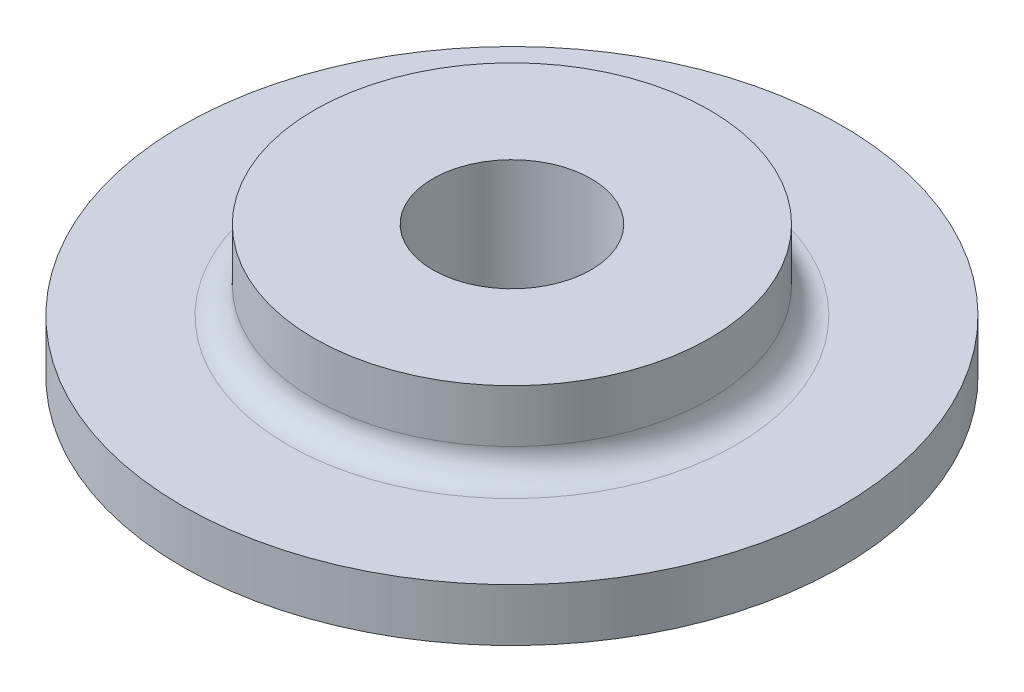
ISO-10303-21;
HEADER;
FILE_DESCRIPTION(('STEP AP214'),'2;1');
FILE_NAME('part.step','',(''),(''),'','','');
FILE_SCHEMA(('AUTOMOTIVE_DESIGN { 1 0 10303 214 1 1 1 1 }'));
ENDSEC;
DATA;
#1=APPLICATION_CONTEXT('core data for automotive mechanical design processes');
#2=APPLICATION_PROTOCOL_DEFINITION('international standard','automotive_design',2000,#1);
#3=PRODUCT_CONTEXT('',#1,'mechanical');
#4=PRODUCT('Part','Part','',(#3));
#5=PRODUCT_RELATED_PRODUCT_CATEGORY('part','',(#4));
#6=PRODUCT_DEFINITION_FORMATION('','',#4);
#7=PRODUCT_DEFINITION_CONTEXT('part definition',#1,'design');
#8=PRODUCT_DEFINITION('design','',#6,#7);
#9=PRODUCT_DEFINITION_SHAPE('','',#8);
#10=(LENGTH_UNIT() NAMED_UNIT(*) SI_UNIT(.MILLI.,.METRE.));
#11=(NAMED_UNIT(*) PLANE_ANGLE_UNIT() SI_UNIT($,.RADIAN.));
#12=(NAMED_UNIT(*) SI_UNIT($,.STERADIAN.) SOLID_ANGLE_UNIT());
#13=UNCERTAINTY_MEASURE_WITH_UNIT(LENGTH_MEASURE(1.E-05),#10,'distance_accuracy_value','');
#14=(GEOMETRIC_REPRESENTATION_CONTEXT(3) GLOBAL_UNCERTAINTY_ASSIGNED_CONTEXT((#13)) GLOBAL_UNIT_ASSIGNED_CONTEXT((#10,
#11,#12)) REPRESENTATION_CONTEXT('',''));
#15=CARTESIAN_POINT('',(0.,0.,0.));
#16=DIRECTION('',(0.,0.,1.));
#17=DIRECTION('',(1.,0.,0.));
#18=AXIS2_PLACEMENT_3D('',#15,#16,#17);
#19=CARTESIAN_POINT('',(0.,2.,0.));
#20=DIRECTION('',(0.,-1.,0.));
#21=DIRECTION('',(0.,0.,-1.));
#22=AXIS2_PLACEMENT_3D('',#19,#20,#21);
#23=CYLINDRICAL_SURFACE('',#22,12.5);
#24=CARTESIAN_POINT('',(0.,2.,0.));
#25=DIRECTION('',(0.,1.,0.));
#26=DIRECTION('',(0.,0.,1.));
#27=AXIS2_PLACEMENT_3D('',#24,#25,#26);
#28=CIRCLE('',#27,12.5);
#29=CARTESIAN_POINT('',(0.,2.,12.5));
#30=VERTEX_POINT('',#29);
#31=EDGE_CURVE('E44',#30,#30,#28,.T.);
#32=ORIENTED_EDGE('',*,*,#31,.F.);
#33=EDGE_LOOP('',(#32));
#34=FACE_BOUND('',#33,.T.);
#35=CARTESIAN_POINT('',(0.,0.,0.));
#36=DIRECTION('',(0.,1.,0.));
#37=DIRECTION('',(0.,0.,1.));
#38=AXIS2_PLACEMENT_3D('',#35,#36,#37);
#39=CIRCLE('',#38,12.5);
#40=CARTESIAN_POINT('',(0.,0.,12.5));
#41=VERTEX_POINT('',#40);
#42=EDGE_CURVE('E48',#41,#41,#39,.T.);
#43=ORIENTED_EDGE('',*,*,#42,.T.);
#44=EDGE_LOOP('',(#43));
#45=FACE_BOUND('',#44,.T.);
#46=ADVANCED_FACE('F33',(#34,#45),#23,.T.);
#47=CARTESIAN_POINT('',(0.,2.,0.));
#48=DIRECTION('',(0.,1.,0.));
#49=DIRECTION('',(0.,0.,1.));
#50=AXIS2_PLACEMENT_3D('',#47,#48,#49);
#51=PLANE('',#50);
#52=CARTESIAN_POINT('',(0.,2.,0.));
#53=DIRECTION('',(0.,1.,0.));
#54=DIRECTION('',(0.,0.,1.));
#55=AXIS2_PLACEMENT_3D('',#52,#53,#54);
#56=CIRCLE('',#55,8.5);
#57=CARTESIAN_POINT('',(0.,2.,8.5));
#58=VERTEX_POINT('',#57);
#59=EDGE_CURVE('E10',#58,#58,#56,.F.);
#60=ORIENTED_EDGE('',*,*,#59,.T.);
#61=EDGE_LOOP('',(#60));
#62=FACE_BOUND('',#61,.T.);
#63=ORIENTED_EDGE('',*,*,#31,.T.);
#64=EDGE_LOOP('',(#63));
#65=FACE_BOUND('',#64,.T.);
#66=ADVANCED_FACE('F81',(#62,#65),#51,.T.);
#67=CARTESIAN_POINT('',(0.,0.,0.));
#68=DIRECTION('',(0.,1.,0.));
#69=DIRECTION('',(0.,0.,1.));
#70=AXIS2_PLACEMENT_3D('',#67,#68,#69);
#71=PLANE('',#70);
#72=CARTESIAN_POINT('',(0.,0.,0.));
#73=DIRECTION('',(0.,1.,0.));
#74=DIRECTION('',(0.,0.,1.));
#75=AXIS2_PLACEMENT_3D('',#72,#73,#74);
#76=CIRCLE('',#75,3.);
#77=CARTESIAN_POINT('',(0.,0.,3.));
#78=VERTEX_POINT('',#77);
#79=EDGE_CURVE('E56',#78,#78,#76,.F.);
#80=ORIENTED_EDGE('',*,*,#79,.F.);
#81=EDGE_LOOP('',(#80));
#82=FACE_BOUND('',#81,.T.);
#83=ORIENTED_EDGE('',*,*,#42,.F.);
#84=EDGE_LOOP('',(#83));
#85=FACE_BOUND('',#84,.T.);
#86=ADVANCED_FACE('F74',(#82,#85),#71,.F.);
#87=CARTESIAN_POINT('',(0.,5.,0.));
#88=DIRECTION('',(0.,-1.,0.));
#89=DIRECTION('',(0.,0.,-1.));
#90=AXIS2_PLACEMENT_3D('',#87,#88,#89);
#91=CYLINDRICAL_SURFACE('',#90,7.5);
#92=CARTESIAN_POINT('',(0.,3.,0.));
#93=DIRECTION('',(0.,1.,0.));
#94=DIRECTION('',(0.,0.,1.));
#95=AXIS2_PLACEMENT_3D('',#92,#93,#94);
#96=CIRCLE('',#95,7.5);
#97=CARTESIAN_POINT('',(0.,3.,7.5));
#98=VERTEX_POINT('',#97);
#99=EDGE_CURVE('E40',#98,#98,#96,.T.);
#100=ORIENTED_EDGE('',*,*,#99,.T.);
#101=EDGE_LOOP('',(#100));
#102=FACE_BOUND('',#101,.T.);
#103=CARTESIAN_POINT('',(0.,5.,0.));
#104=DIRECTION('',(0.,1.,0.));
#105=DIRECTION('',(0.,0.,1.));
#106=AXIS2_PLACEMENT_3D('',#103,#104,#105);
#107=CIRCLE('',#106,7.5);
#108=CARTESIAN_POINT('',(0.,5.,7.5));
#109=VERTEX_POINT('',#108);
#110=EDGE_CURVE('E52',#109,#109,#107,.T.);
#111=ORIENTED_EDGE('',*,*,#110,.F.);
#112=EDGE_LOOP('',(#111));
#113=FACE_BOUND('',#112,.T.);
#114=ADVANCED_FACE('F69',(#102,#113),#91,.T.);
#115=CARTESIAN_POINT('',(0.,5.,0.));
#116=DIRECTION('',(0.,1.,0.));
#117=DIRECTION('',(0.,0.,1.));
#118=AXIS2_PLACEMENT_3D('',#115,#116,#117);
#119=PLANE('',#118);
#120=CARTESIAN_POINT('',(0.,5.,0.));
#121=DIRECTION('',(0.,1.,0.));
#122=DIRECTION('',(0.,0.,1.));
#123=AXIS2_PLACEMENT_3D('',#120,#121,#122);
#124=CIRCLE('',#123,3.);
#125=CARTESIAN_POINT('',(0.,5.,3.));
#126=VERTEX_POINT('',#125);
#127=EDGE_CURVE('E59',#126,#126,#124,.T.);
#128=ORIENTED_EDGE('',*,*,#127,.F.);
#129=EDGE_LOOP('',(#128));
#130=FACE_BOUND('',#129,.T.);
#131=ORIENTED_EDGE('',*,*,#110,.T.);
#132=EDGE_LOOP('',(#131));
#133=FACE_BOUND('',#132,.T.);
#134=ADVANCED_FACE('F66',(#130,#133),#119,.T.);
#135=CARTESIAN_POINT('',(0.,3.,0.));
#136=DIRECTION('',(0.,1.,0.));
#137=DIRECTION('',(0.,0.,1.));
#138=AXIS2_PLACEMENT_3D('',#135,#136,#137);
#139=TOROIDAL_SURFACE('',#138,8.5,1.);
#140=ORIENTED_EDGE('',*,*,#59,.F.);
#141=EDGE_LOOP('',(#140));
#142=FACE_BOUND('',#141,.T.);
#143=ORIENTED_EDGE('',*,*,#99,.F.);
#144=EDGE_LOOP('',(#143));
#145=FACE_BOUND('',#144,.T.);
#146=ADVANCED_FACE('F35',(#142,#145),#139,.F.);
#147=CARTESIAN_POINT('',(0.,-0.00100000000000013,0.));
#148=DIRECTION('',(0.,1.,0.));
#149=DIRECTION('',(0.,0.,1.));
#150=AXIS2_PLACEMENT_3D('',#147,#148,#149);
#151=CYLINDRICAL_SURFACE('',#150,3.);
#152=ORIENTED_EDGE('',*,*,#127,.T.);
#153=EDGE_LOOP('',(#152));
#154=FACE_BOUND('',#153,.T.);
#155=ORIENTED_EDGE('',*,*,#79,.T.);
#156=EDGE_LOOP('',(#155));
#157=FACE_BOUND('',#156,.T.);
#158=ADVANCED_FACE('F63',(#154,#157),#151,.F.);
#159=CLOSED_SHELL('',(#46,#66,#86,#114,#134,#146,#158));
#160=MANIFOLD_SOLID_BREP('B2',#159);
#161=ADVANCED_BREP_SHAPE_REPRESENTATION('',(#18,#160),#14);
#162=SHAPE_DEFINITION_REPRESENTATION(#9,#161);
ENDSEC;
END-ISO-10303-21;
